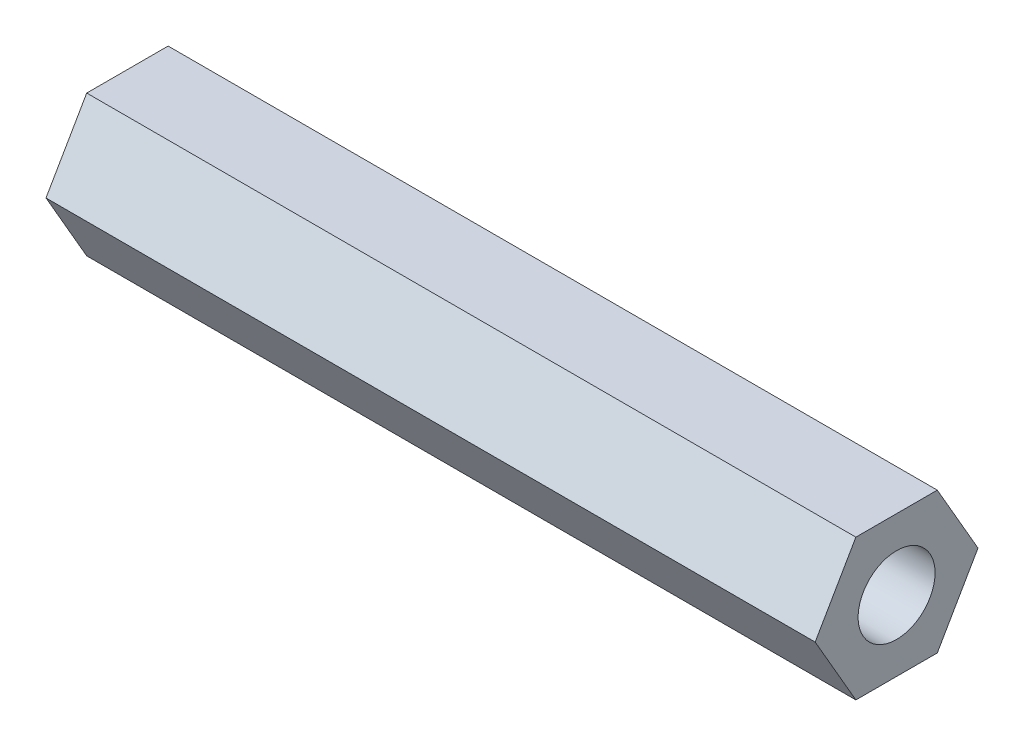
ISO-10303-21;
HEADER;
FILE_DESCRIPTION(('STEP AP214'),'2;1');
FILE_NAME('part.step','',(''),(''),'','','');
FILE_SCHEMA(('AUTOMOTIVE_DESIGN { 1 0 10303 214 1 1 1 1 }'));
ENDSEC;
DATA;
#1=APPLICATION_CONTEXT('core data for automotive mechanical design processes');
#2=APPLICATION_PROTOCOL_DEFINITION('international standard','automotive_design',2000,#1);
#3=PRODUCT_CONTEXT('',#1,'mechanical');
#4=PRODUCT('Part','Part','',(#3));
#5=PRODUCT_RELATED_PRODUCT_CATEGORY('part','',(#4));
#6=PRODUCT_DEFINITION_FORMATION('','',#4);
#7=PRODUCT_DEFINITION_CONTEXT('part definition',#1,'design');
#8=PRODUCT_DEFINITION('design','',#6,#7);
#9=PRODUCT_DEFINITION_SHAPE('','',#8);
#10=(LENGTH_UNIT() NAMED_UNIT(*) SI_UNIT(.MILLI.,.METRE.));
#11=(NAMED_UNIT(*) PLANE_ANGLE_UNIT() SI_UNIT($,.RADIAN.));
#12=(NAMED_UNIT(*) SI_UNIT($,.STERADIAN.) SOLID_ANGLE_UNIT());
#13=UNCERTAINTY_MEASURE_WITH_UNIT(LENGTH_MEASURE(1.E-05),#10,'distance_accuracy_value','');
#14=(GEOMETRIC_REPRESENTATION_CONTEXT(3) GLOBAL_UNCERTAINTY_ASSIGNED_CONTEXT((#13)) GLOBAL_UNIT_ASSIGNED_CONTEXT((#10,
#11,#12)) REPRESENTATION_CONTEXT('',''));
#15=CARTESIAN_POINT('',(0.,0.,0.));
#16=DIRECTION('',(0.,0.,1.));
#17=DIRECTION('',(1.,0.,0.));
#18=AXIS2_PLACEMENT_3D('',#15,#16,#17);
#19=CARTESIAN_POINT('',(30.,-2.75,-1.58771324027147));
#20=DIRECTION('',(0.,0.5,0.866025403784439));
#21=DIRECTION('',(0.,-0.866025403784439,0.5));
#22=AXIS2_PLACEMENT_3D('',#19,#20,#21);
#23=PLANE('',#22);
#24=DIRECTION('',(0.,0.866025403784439,-0.5));
#25=VECTOR('',#24,1.);
#26=CARTESIAN_POINT('',(0.,-2.75,-1.58771324027147));
#27=LINE('',#26,#25);
#28=CARTESIAN_POINT('',(0.,-2.75,-1.58771324027147));
#29=VERTEX_POINT('',#28);
#30=CARTESIAN_POINT('',(0.,0.,-3.17542648054294));
#31=VERTEX_POINT('',#30);
#32=EDGE_CURVE('E127',#29,#31,#27,.T.);
#33=ORIENTED_EDGE('',*,*,#32,.T.);
#34=DIRECTION('',(-1.,0.,0.));
#35=VECTOR('',#34,1.);
#36=CARTESIAN_POINT('',(30.,0.,-3.17542648054294));
#37=LINE('',#36,#35);
#38=CARTESIAN_POINT('',(30.,0.,-3.17542648054294));
#39=VERTEX_POINT('',#38);
#40=EDGE_CURVE('E11',#39,#31,#37,.T.);
#41=ORIENTED_EDGE('',*,*,#40,.F.);
#42=DIRECTION('',(0.,0.866025403784439,-0.5));
#43=VECTOR('',#42,1.);
#44=CARTESIAN_POINT('',(30.,-2.75,-1.58771324027147));
#45=LINE('',#44,#43);
#46=CARTESIAN_POINT('',(30.,-2.75,-1.58771324027147));
#47=VERTEX_POINT('',#46);
#48=EDGE_CURVE('E139',#47,#39,#45,.T.);
#49=ORIENTED_EDGE('',*,*,#48,.F.);
#50=DIRECTION('',(-1.,0.,0.));
#51=VECTOR('',#50,1.);
#52=CARTESIAN_POINT('',(30.,-2.75,-1.58771324027147));
#53=LINE('',#52,#51);
#54=EDGE_CURVE('E124',#47,#29,#53,.T.);
#55=ORIENTED_EDGE('',*,*,#54,.T.);
#56=EDGE_LOOP('',(#33,#41,#49,#55));
#57=FACE_BOUND('',#56,.T.);
#58=ADVANCED_FACE('F41',(#57),#23,.F.);
#59=CARTESIAN_POINT('',(30.,0.,-3.17542648054294));
#60=DIRECTION('',(0.,-0.5,0.866025403784439));
#61=DIRECTION('',(0.,-0.866025403784439,-0.5));
#62=AXIS2_PLACEMENT_3D('',#59,#60,#61);
#63=PLANE('',#62);
#64=DIRECTION('',(0.,0.866025403784439,0.5));
#65=VECTOR('',#64,1.);
#66=CARTESIAN_POINT('',(0.,0.,-3.17542648054294));
#67=LINE('',#66,#65);
#68=CARTESIAN_POINT('',(0.,2.75,-1.58771324027147));
#69=VERTEX_POINT('',#68);
#70=EDGE_CURVE('E129',#31,#69,#67,.T.);
#71=ORIENTED_EDGE('',*,*,#70,.T.);
#72=DIRECTION('',(-1.,0.,0.));
#73=VECTOR('',#72,1.);
#74=CARTESIAN_POINT('',(30.,2.75,-1.58771324027147));
#75=LINE('',#74,#73);
#76=CARTESIAN_POINT('',(30.,2.75,-1.58771324027147));
#77=VERTEX_POINT('',#76);
#78=EDGE_CURVE('E49',#77,#69,#75,.T.);
#79=ORIENTED_EDGE('',*,*,#78,.F.);
#80=DIRECTION('',(0.,0.866025403784439,0.5));
#81=VECTOR('',#80,1.);
#82=CARTESIAN_POINT('',(30.,0.,-3.17542648054294));
#83=LINE('',#82,#81);
#84=EDGE_CURVE('E92',#39,#77,#83,.T.);
#85=ORIENTED_EDGE('',*,*,#84,.F.);
#86=ORIENTED_EDGE('',*,*,#40,.T.);
#87=EDGE_LOOP('',(#71,#79,#85,#86));
#88=FACE_BOUND('',#87,.T.);
#89=ADVANCED_FACE('F162',(#88),#63,.F.);
#90=CARTESIAN_POINT('',(30.,2.75,-1.58771324027147));
#91=DIRECTION('',(0.,-1.,0.));
#92=DIRECTION('',(0.,0.,-1.));
#93=AXIS2_PLACEMENT_3D('',#90,#91,#92);
#94=PLANE('',#93);
#95=DIRECTION('',(0.,0.,1.));
#96=VECTOR('',#95,1.);
#97=CARTESIAN_POINT('',(0.,2.75,-1.58771324027147));
#98=LINE('',#97,#96);
#99=CARTESIAN_POINT('',(0.,2.75,1.58771324027147));
#100=VERTEX_POINT('',#99);
#101=EDGE_CURVE('E131',#69,#100,#98,.T.);
#102=ORIENTED_EDGE('',*,*,#101,.T.);
#103=DIRECTION('',(-1.,0.,0.));
#104=VECTOR('',#103,1.);
#105=CARTESIAN_POINT('',(30.,2.75,1.58771324027147));
#106=LINE('',#105,#104);
#107=CARTESIAN_POINT('',(30.,2.75,1.58771324027147));
#108=VERTEX_POINT('',#107);
#109=EDGE_CURVE('E116',#108,#100,#106,.T.);
#110=ORIENTED_EDGE('',*,*,#109,.F.);
#111=DIRECTION('',(0.,0.,1.));
#112=VECTOR('',#111,1.);
#113=CARTESIAN_POINT('',(30.,2.75,-1.58771324027147));
#114=LINE('',#113,#112);
#115=EDGE_CURVE('E107',#77,#108,#114,.T.);
#116=ORIENTED_EDGE('',*,*,#115,.F.);
#117=ORIENTED_EDGE('',*,*,#78,.T.);
#118=EDGE_LOOP('',(#102,#110,#116,#117));
#119=FACE_BOUND('',#118,.T.);
#120=ADVANCED_FACE('F145',(#119),#94,.F.);
#121=CARTESIAN_POINT('',(30.,2.75,1.58771324027147));
#122=DIRECTION('',(0.,-0.5,-0.866025403784439));
#123=DIRECTION('',(0.,0.866025403784439,-0.5));
#124=AXIS2_PLACEMENT_3D('',#121,#122,#123);
#125=PLANE('',#124);
#126=DIRECTION('',(0.,-0.866025403784438,0.5));
#127=VECTOR('',#126,1.);
#128=CARTESIAN_POINT('',(0.,2.75,1.58771324027147));
#129=LINE('',#128,#127);
#130=CARTESIAN_POINT('',(0.,0.,3.17542648054294));
#131=VERTEX_POINT('',#130);
#132=EDGE_CURVE('E119',#100,#131,#129,.T.);
#133=ORIENTED_EDGE('',*,*,#132,.T.);
#134=DIRECTION('',(-1.,0.,0.));
#135=VECTOR('',#134,1.);
#136=CARTESIAN_POINT('',(30.,0.,3.17542648054294));
#137=LINE('',#136,#135);
#138=CARTESIAN_POINT('',(30.,0.,3.17542648054294));
#139=VERTEX_POINT('',#138);
#140=EDGE_CURVE('E114',#139,#131,#137,.T.);
#141=ORIENTED_EDGE('',*,*,#140,.F.);
#142=DIRECTION('',(0.,-0.866025403784438,0.5));
#143=VECTOR('',#142,1.);
#144=CARTESIAN_POINT('',(30.,2.75,1.58771324027147));
#145=LINE('',#144,#143);
#146=EDGE_CURVE('E105',#108,#139,#145,.T.);
#147=ORIENTED_EDGE('',*,*,#146,.F.);
#148=ORIENTED_EDGE('',*,*,#109,.T.);
#149=EDGE_LOOP('',(#133,#141,#147,#148));
#150=FACE_BOUND('',#149,.T.);
#151=ADVANCED_FACE('F111',(#150),#125,.F.);
#152=CARTESIAN_POINT('',(30.,0.,3.17542648054294));
#153=DIRECTION('',(0.,0.5,-0.866025403784439));
#154=DIRECTION('',(0.,0.866025403784439,0.5));
#155=AXIS2_PLACEMENT_3D('',#152,#153,#154);
#156=PLANE('',#155);
#157=DIRECTION('',(0.,-0.866025403784439,-0.5));
#158=VECTOR('',#157,1.);
#159=CARTESIAN_POINT('',(0.,0.,3.17542648054294));
#160=LINE('',#159,#158);
#161=CARTESIAN_POINT('',(0.,-2.75,1.58771324027147));
#162=VERTEX_POINT('',#161);
#163=EDGE_CURVE('E83',#131,#162,#160,.T.);
#164=ORIENTED_EDGE('',*,*,#163,.T.);
#165=DIRECTION('',(-1.,0.,0.));
#166=VECTOR('',#165,1.);
#167=CARTESIAN_POINT('',(30.,-2.75,1.58771324027147));
#168=LINE('',#167,#166);
#169=CARTESIAN_POINT('',(30.,-2.75,1.58771324027147));
#170=VERTEX_POINT('',#169);
#171=EDGE_CURVE('E120',#170,#162,#168,.T.);
#172=ORIENTED_EDGE('',*,*,#171,.F.);
#173=DIRECTION('',(0.,-0.866025403784439,-0.5));
#174=VECTOR('',#173,1.);
#175=CARTESIAN_POINT('',(30.,0.,3.17542648054294));
#176=LINE('',#175,#174);
#177=EDGE_CURVE('E106',#139,#170,#176,.T.);
#178=ORIENTED_EDGE('',*,*,#177,.F.);
#179=ORIENTED_EDGE('',*,*,#140,.T.);
#180=EDGE_LOOP('',(#164,#172,#178,#179));
#181=FACE_BOUND('',#180,.T.);
#182=ADVANCED_FACE('F117',(#181),#156,.F.);
#183=CARTESIAN_POINT('',(30.,-2.75,1.58771324027147));
#184=DIRECTION('',(0.,1.,0.));
#185=DIRECTION('',(0.,0.,1.));
#186=AXIS2_PLACEMENT_3D('',#183,#184,#185);
#187=PLANE('',#186);
#188=DIRECTION('',(0.,0.,-1.));
#189=VECTOR('',#188,1.);
#190=CARTESIAN_POINT('',(0.,-2.75,1.58771324027147));
#191=LINE('',#190,#189);
#192=EDGE_CURVE('E87',#162,#29,#191,.T.);
#193=ORIENTED_EDGE('',*,*,#192,.T.);
#194=ORIENTED_EDGE('',*,*,#54,.F.);
#195=DIRECTION('',(0.,0.,-1.));
#196=VECTOR('',#195,1.);
#197=CARTESIAN_POINT('',(30.,-2.75,1.58771324027147));
#198=LINE('',#197,#196);
#199=EDGE_CURVE('E59',#170,#47,#198,.T.);
#200=ORIENTED_EDGE('',*,*,#199,.F.);
#201=ORIENTED_EDGE('',*,*,#171,.T.);
#202=EDGE_LOOP('',(#193,#194,#200,#201));
#203=FACE_BOUND('',#202,.T.);
#204=ADVANCED_FACE('F151',(#203),#187,.F.);
#205=CARTESIAN_POINT('',(30.,0.,0.));
#206=DIRECTION('',(1.,0.,0.));
#207=DIRECTION('',(0.,0.,-1.));
#208=AXIS2_PLACEMENT_3D('',#205,#206,#207);
#209=PLANE('',#208);
#210=CARTESIAN_POINT('',(30.,0.,0.));
#211=DIRECTION('',(1.,0.,0.));
#212=DIRECTION('',(0.,0.,-1.));
#213=AXIS2_PLACEMENT_3D('',#210,#211,#212);
#214=CIRCLE('',#213,1.5);
#215=CARTESIAN_POINT('',(30.,0.,-1.5));
#216=VERTEX_POINT('',#215);
#217=EDGE_CURVE('E128',#216,#216,#214,.F.);
#218=ORIENTED_EDGE('',*,*,#217,.T.);
#219=EDGE_LOOP('',(#218));
#220=FACE_BOUND('',#219,.T.);
#221=ORIENTED_EDGE('',*,*,#48,.T.);
#222=ORIENTED_EDGE('',*,*,#84,.T.);
#223=ORIENTED_EDGE('',*,*,#115,.T.);
#224=ORIENTED_EDGE('',*,*,#146,.T.);
#225=ORIENTED_EDGE('',*,*,#177,.T.);
#226=ORIENTED_EDGE('',*,*,#199,.T.);
#227=EDGE_LOOP('',(#221,#222,#223,#224,#225,#226));
#228=FACE_BOUND('',#227,.T.);
#229=ADVANCED_FACE('F102',(#220,#228),#209,.T.);
#230=CARTESIAN_POINT('',(0.,0.,0.));
#231=DIRECTION('',(1.,0.,0.));
#232=DIRECTION('',(0.,0.,-1.));
#233=AXIS2_PLACEMENT_3D('',#230,#231,#232);
#234=PLANE('',#233);
#235=CARTESIAN_POINT('',(0.,0.,0.));
#236=DIRECTION('',(1.,0.,0.));
#237=DIRECTION('',(0.,0.,-1.));
#238=AXIS2_PLACEMENT_3D('',#235,#236,#237);
#239=CIRCLE('',#238,1.5);
#240=CARTESIAN_POINT('',(0.,0.,-1.5));
#241=VERTEX_POINT('',#240);
#242=EDGE_CURVE('E42',#241,#241,#239,.F.);
#243=ORIENTED_EDGE('',*,*,#242,.F.);
#244=EDGE_LOOP('',(#243));
#245=FACE_BOUND('',#244,.T.);
#246=ORIENTED_EDGE('',*,*,#32,.F.);
#247=ORIENTED_EDGE('',*,*,#192,.F.);
#248=ORIENTED_EDGE('',*,*,#163,.F.);
#249=ORIENTED_EDGE('',*,*,#132,.F.);
#250=ORIENTED_EDGE('',*,*,#101,.F.);
#251=ORIENTED_EDGE('',*,*,#70,.F.);
#252=EDGE_LOOP('',(#246,#247,#248,#249,#250,#251));
#253=FACE_BOUND('',#252,.T.);
#254=ADVANCED_FACE('F150',(#245,#253),#234,.F.);
#255=CARTESIAN_POINT('',(-400.,0.,0.));
#256=DIRECTION('',(-1.,0.,0.));
#257=DIRECTION('',(0.,0.,1.));
#258=AXIS2_PLACEMENT_3D('',#255,#256,#257);
#259=CYLINDRICAL_SURFACE('',#258,1.5);
#260=ORIENTED_EDGE('',*,*,#217,.F.);
#261=EDGE_LOOP('',(#260));
#262=FACE_BOUND('',#261,.T.);
#263=ORIENTED_EDGE('',*,*,#242,.T.);
#264=EDGE_LOOP('',(#263));
#265=FACE_BOUND('',#264,.T.);
#266=ADVANCED_FACE('F205',(#262,#265),#259,.F.);
#267=CLOSED_SHELL('',(#58,#89,#120,#151,#182,#204,#229,#254,#266));
#268=MANIFOLD_SOLID_BREP('B2',#267);
#269=ADVANCED_BREP_SHAPE_REPRESENTATION('',(#18,#268),#14);
#270=SHAPE_DEFINITION_REPRESENTATION(#9,#269);
ENDSEC;
END-ISO-10303-21;
